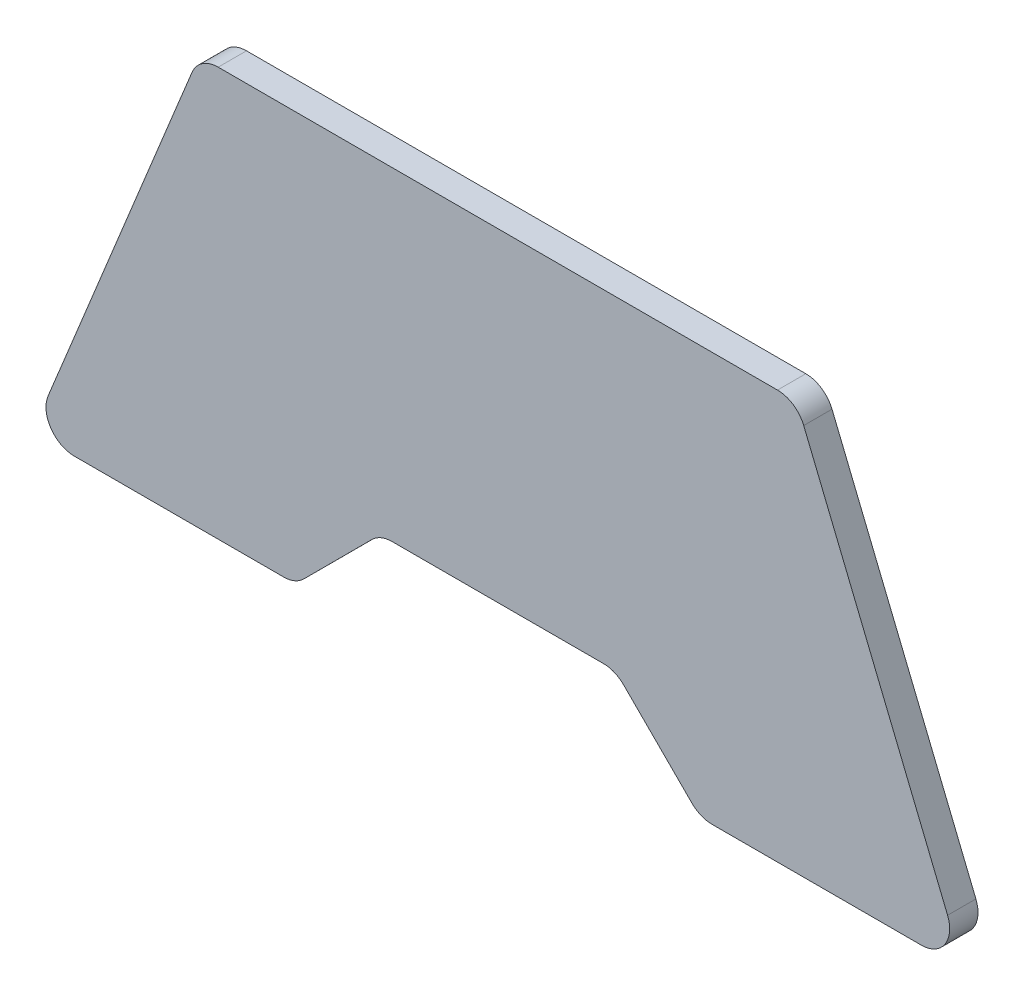
ISO-10303-21;
HEADER;
FILE_DESCRIPTION(('STEP AP214'),'2;1');
FILE_NAME('part.step','',(''),(''),'','','');
FILE_SCHEMA(('AUTOMOTIVE_DESIGN { 1 0 10303 214 1 1 1 1 }'));
ENDSEC;
DATA;
#1=APPLICATION_CONTEXT('core data for automotive mechanical design processes');
#2=APPLICATION_PROTOCOL_DEFINITION('international standard','automotive_design',2000,#1);
#3=PRODUCT_CONTEXT('',#1,'mechanical');
#4=PRODUCT('Part','Part','',(#3));
#5=PRODUCT_RELATED_PRODUCT_CATEGORY('part','',(#4));
#6=PRODUCT_DEFINITION_FORMATION('','',#4);
#7=PRODUCT_DEFINITION_CONTEXT('part definition',#1,'design');
#8=PRODUCT_DEFINITION('design','',#6,#7);
#9=PRODUCT_DEFINITION_SHAPE('','',#8);
#10=(LENGTH_UNIT() NAMED_UNIT(*) SI_UNIT(.MILLI.,.METRE.));
#11=(NAMED_UNIT(*) PLANE_ANGLE_UNIT() SI_UNIT($,.RADIAN.));
#12=(NAMED_UNIT(*) SI_UNIT($,.STERADIAN.) SOLID_ANGLE_UNIT());
#13=UNCERTAINTY_MEASURE_WITH_UNIT(LENGTH_MEASURE(1.E-05),#10,'distance_accuracy_value','');
#14=(GEOMETRIC_REPRESENTATION_CONTEXT(3) GLOBAL_UNCERTAINTY_ASSIGNED_CONTEXT((#13)) GLOBAL_UNIT_ASSIGNED_CONTEXT((#10,
#11,#12)) REPRESENTATION_CONTEXT('',''));
#15=CARTESIAN_POINT('',(0.,0.,0.));
#16=DIRECTION('',(0.,0.,1.));
#17=DIRECTION('',(1.,0.,0.));
#18=AXIS2_PLACEMENT_3D('',#15,#16,#17);
#19=CARTESIAN_POINT('',(-37.8060391873772,-9.99999999999998,5.));
#20=DIRECTION('',(0.,0.,-1.));
#21=DIRECTION('',(-1.,0.,0.));
#22=AXIS2_PLACEMENT_3D('',#19,#20,#21);
#23=CYLINDRICAL_SURFACE('',#22,5.);
#24=CARTESIAN_POINT('',(-37.8060391873772,-9.99999999999998,0.));
#25=DIRECTION('',(0.,0.,1.));
#26=DIRECTION('',(-1.,0.,0.));
#27=AXIS2_PLACEMENT_3D('',#24,#25,#26);
#28=CIRCLE('',#27,5.);
#29=CARTESIAN_POINT('',(-37.8060391873772,-15.,0.));
#30=VERTEX_POINT('',#29);
#31=CARTESIAN_POINT('',(-34.2683033383206,-13.5333305905759,0.));
#32=VERTEX_POINT('',#31);
#33=EDGE_CURVE('E177',#30,#32,#28,.T.);
#34=ORIENTED_EDGE('',*,*,#33,.T.);
#35=DIRECTION('',(0.,0.,-1.));
#36=VECTOR('',#35,1.);
#37=CARTESIAN_POINT('',(-34.2683033383206,-13.5333305905759,5.));
#38=LINE('',#37,#36);
#39=CARTESIAN_POINT('',(-34.2683033383206,-13.5333305905759,5.));
#40=VERTEX_POINT('',#39);
#41=EDGE_CURVE('E11',#40,#32,#38,.T.);
#42=ORIENTED_EDGE('',*,*,#41,.F.);
#43=CARTESIAN_POINT('',(-37.8060391873772,-9.99999999999998,5.));
#44=DIRECTION('',(0.,0.,1.));
#45=DIRECTION('',(-1.,0.,0.));
#46=AXIS2_PLACEMENT_3D('',#43,#44,#45);
#47=CIRCLE('',#46,5.);
#48=CARTESIAN_POINT('',(-37.8060391873772,-15.,5.));
#49=VERTEX_POINT('',#48);
#50=EDGE_CURVE('E207',#49,#40,#47,.T.);
#51=ORIENTED_EDGE('',*,*,#50,.F.);
#52=DIRECTION('',(0.,0.,-1.));
#53=VECTOR('',#52,1.);
#54=CARTESIAN_POINT('',(-37.8060391873772,-15.,5.));
#55=LINE('',#54,#53);
#56=EDGE_CURVE('E173',#49,#30,#55,.T.);
#57=ORIENTED_EDGE('',*,*,#56,.T.);
#58=EDGE_LOOP('',(#34,#42,#51,#57));
#59=FACE_BOUND('',#58,.T.);
#60=ADVANCED_FACE('F33',(#59),#23,.T.);
#61=CARTESIAN_POINT('',(-22.2166678017531,-1.46666940942405,5.));
#62=DIRECTION('',(-0.70754716981132,0.70666611811519,0.));
#63=DIRECTION('',(-0.70666611811519,-0.70754716981132,0.));
#64=AXIS2_PLACEMENT_3D('',#61,#62,#63);
#65=PLANE('',#64);
#66=DIRECTION('',(0.70666611811519,0.70754716981132,0.));
#67=VECTOR('',#66,1.);
#68=CARTESIAN_POINT('',(-22.2166678017531,-1.46666940942405,0.));
#69=LINE('',#68,#67);
#70=CARTESIAN_POINT('',(-22.2166678017531,-1.46666940942405,0.));
#71=VERTEX_POINT('',#70);
#72=EDGE_CURVE('E180',#32,#71,#69,.T.);
#73=ORIENTED_EDGE('',*,*,#72,.T.);
#74=DIRECTION('',(0.,0.,-1.));
#75=VECTOR('',#74,1.);
#76=CARTESIAN_POINT('',(-22.2166678017531,-1.46666940942405,5.));
#77=LINE('',#76,#75);
#78=CARTESIAN_POINT('',(-22.2166678017531,-1.46666940942405,5.));
#79=VERTEX_POINT('',#78);
#80=EDGE_CURVE('E41',#79,#71,#77,.T.);
#81=ORIENTED_EDGE('',*,*,#80,.F.);
#82=DIRECTION('',(0.70666611811519,0.70754716981132,0.));
#83=VECTOR('',#82,1.);
#84=CARTESIAN_POINT('',(-22.2166678017531,-1.46666940942405,5.));
#85=LINE('',#84,#83);
#86=EDGE_CURVE('E116',#40,#79,#85,.T.);
#87=ORIENTED_EDGE('',*,*,#86,.F.);
#88=ORIENTED_EDGE('',*,*,#41,.T.);
#89=EDGE_LOOP('',(#73,#81,#87,#88));
#90=FACE_BOUND('',#89,.T.);
#91=ADVANCED_FACE('F305',(#90),#65,.F.);
#92=CARTESIAN_POINT('',(-18.6789319526965,-5.,5.));
#93=DIRECTION('',(0.,0.,-1.));
#94=DIRECTION('',(-1.,0.,0.));
#95=AXIS2_PLACEMENT_3D('',#92,#93,#94);
#96=CYLINDRICAL_SURFACE('',#95,5.);
#97=CARTESIAN_POINT('',(-18.6789319526965,-5.,0.));
#98=DIRECTION('',(0.,0.,-1.));
#99=DIRECTION('',(1.,0.,0.));
#100=AXIS2_PLACEMENT_3D('',#97,#98,#99);
#101=CIRCLE('',#100,5.);
#102=CARTESIAN_POINT('',(-18.6789319526965,0.,0.));
#103=VERTEX_POINT('',#102);
#104=EDGE_CURVE('E182',#71,#103,#101,.T.);
#105=ORIENTED_EDGE('',*,*,#104,.T.);
#106=DIRECTION('',(0.,0.,-1.));
#107=VECTOR('',#106,1.);
#108=CARTESIAN_POINT('',(-18.6789319526965,0.,5.));
#109=LINE('',#108,#107);
#110=CARTESIAN_POINT('',(-18.6789319526965,0.,5.));
#111=VERTEX_POINT('',#110);
#112=EDGE_CURVE('E238',#111,#103,#109,.T.);
#113=ORIENTED_EDGE('',*,*,#112,.F.);
#114=CARTESIAN_POINT('',(-18.6789319526965,-5.,5.));
#115=DIRECTION('',(0.,0.,-1.));
#116=DIRECTION('',(1.,0.,0.));
#117=AXIS2_PLACEMENT_3D('',#114,#115,#116);
#118=CIRCLE('',#117,5.);
#119=EDGE_CURVE('E246',#79,#111,#118,.T.);
#120=ORIENTED_EDGE('',*,*,#119,.F.);
#121=ORIENTED_EDGE('',*,*,#80,.T.);
#122=EDGE_LOOP('',(#105,#113,#120,#121));
#123=FACE_BOUND('',#122,.T.);
#124=ADVANCED_FACE('F244',(#123),#96,.F.);
#125=CARTESIAN_POINT('',(18.6789319526965,0.,5.));
#126=DIRECTION('',(0.,1.,0.));
#127=DIRECTION('',(-1.,0.,0.));
#128=AXIS2_PLACEMENT_3D('',#125,#126,#127);
#129=PLANE('',#128);
#130=DIRECTION('',(1.,0.,0.));
#131=VECTOR('',#130,1.);
#132=CARTESIAN_POINT('',(18.6789319526965,0.,0.));
#133=LINE('',#132,#131);
#134=CARTESIAN_POINT('',(18.6789319526965,0.,0.));
#135=VERTEX_POINT('',#134);
#136=EDGE_CURVE('E184',#103,#135,#133,.T.);
#137=ORIENTED_EDGE('',*,*,#136,.T.);
#138=DIRECTION('',(0.,0.,-1.));
#139=VECTOR('',#138,1.);
#140=CARTESIAN_POINT('',(18.6789319526965,0.,5.));
#141=LINE('',#140,#139);
#142=CARTESIAN_POINT('',(18.6789319526965,0.,5.));
#143=VERTEX_POINT('',#142);
#144=EDGE_CURVE('E235',#143,#135,#141,.T.);
#145=ORIENTED_EDGE('',*,*,#144,.F.);
#146=DIRECTION('',(1.,0.,0.));
#147=VECTOR('',#146,1.);
#148=CARTESIAN_POINT('',(18.6789319526965,0.,5.));
#149=LINE('',#148,#147);
#150=EDGE_CURVE('E264',#111,#143,#149,.T.);
#151=ORIENTED_EDGE('',*,*,#150,.F.);
#152=ORIENTED_EDGE('',*,*,#112,.T.);
#153=EDGE_LOOP('',(#137,#145,#151,#152));
#154=FACE_BOUND('',#153,.T.);
#155=ADVANCED_FACE('F255',(#154),#129,.F.);
#156=CARTESIAN_POINT('',(18.6789319526965,-4.99999999999999,5.));
#157=DIRECTION('',(0.,0.,-1.));
#158=DIRECTION('',(-1.,0.,0.));
#159=AXIS2_PLACEMENT_3D('',#156,#157,#158);
#160=CYLINDRICAL_SURFACE('',#159,5.);
#161=CARTESIAN_POINT('',(18.6789319526965,-4.99999999999999,0.));
#162=DIRECTION('',(0.,0.,-1.));
#163=DIRECTION('',(1.,0.,0.));
#164=AXIS2_PLACEMENT_3D('',#161,#162,#163);
#165=CIRCLE('',#164,5.);
#166=CARTESIAN_POINT('',(22.2122625432725,-1.4622641509434,0.));
#167=VERTEX_POINT('',#166);
#168=EDGE_CURVE('E186',#135,#167,#165,.T.);
#169=ORIENTED_EDGE('',*,*,#168,.T.);
#170=DIRECTION('',(0.,0.,-1.));
#171=VECTOR('',#170,1.);
#172=CARTESIAN_POINT('',(22.2122625432725,-1.4622641509434,5.));
#173=LINE('',#172,#171);
#174=CARTESIAN_POINT('',(22.2122625432725,-1.4622641509434,5.));
#175=VERTEX_POINT('',#174);
#176=EDGE_CURVE('E232',#175,#167,#173,.T.);
#177=ORIENTED_EDGE('',*,*,#176,.F.);
#178=CARTESIAN_POINT('',(18.6789319526965,-4.99999999999999,5.));
#179=DIRECTION('',(0.,0.,-1.));
#180=DIRECTION('',(1.,0.,0.));
#181=AXIS2_PLACEMENT_3D('',#178,#179,#180);
#182=CIRCLE('',#181,5.);
#183=EDGE_CURVE('E261',#143,#175,#182,.T.);
#184=ORIENTED_EDGE('',*,*,#183,.F.);
#185=ORIENTED_EDGE('',*,*,#144,.T.);
#186=EDGE_LOOP('',(#169,#177,#184,#185));
#187=FACE_BOUND('',#186,.T.);
#188=ADVANCED_FACE('F259',(#187),#160,.F.);
#189=CARTESIAN_POINT('',(22.2122625432725,-1.46226415094339,5.));
#190=DIRECTION('',(0.706666118115189,0.70754716981132,0.));
#191=DIRECTION('',(-0.70754716981132,0.706666118115189,0.));
#192=AXIS2_PLACEMENT_3D('',#189,#190,#191);
#193=PLANE('',#192);
#194=DIRECTION('',(0.70754716981132,-0.70666611811519,0.));
#195=VECTOR('',#194,1.);
#196=CARTESIAN_POINT('',(22.2122625432725,-1.46226415094339,0.));
#197=LINE('',#196,#195);
#198=CARTESIAN_POINT('',(34.3027896042345,-13.5377358490566,0.));
#199=VERTEX_POINT('',#198);
#200=EDGE_CURVE('E188',#167,#199,#197,.T.);
#201=ORIENTED_EDGE('',*,*,#200,.T.);
#202=DIRECTION('',(0.,0.,-1.));
#203=VECTOR('',#202,1.);
#204=CARTESIAN_POINT('',(34.3027896042345,-13.5377358490566,5.));
#205=LINE('',#204,#203);
#206=CARTESIAN_POINT('',(34.3027896042345,-13.5377358490566,5.));
#207=VERTEX_POINT('',#206);
#208=EDGE_CURVE('E229',#207,#199,#205,.T.);
#209=ORIENTED_EDGE('',*,*,#208,.F.);
#210=DIRECTION('',(0.70754716981132,-0.70666611811519,0.));
#211=VECTOR('',#210,1.);
#212=CARTESIAN_POINT('',(22.2122625432725,-1.46226415094339,5.));
#213=LINE('',#212,#211);
#214=EDGE_CURVE('E263',#175,#207,#213,.T.);
#215=ORIENTED_EDGE('',*,*,#214,.F.);
#216=ORIENTED_EDGE('',*,*,#176,.T.);
#217=EDGE_LOOP('',(#201,#209,#215,#216));
#218=FACE_BOUND('',#217,.T.);
#219=ADVANCED_FACE('F318',(#218),#193,.F.);
#220=CARTESIAN_POINT('',(37.8361201948105,-10.,5.));
#221=DIRECTION('',(0.,0.,-1.));
#222=DIRECTION('',(-1.,0.,0.));
#223=AXIS2_PLACEMENT_3D('',#220,#221,#222);
#224=CYLINDRICAL_SURFACE('',#223,5.);
#225=CARTESIAN_POINT('',(37.8361201948105,-10.,0.));
#226=DIRECTION('',(0.,0.,1.));
#227=DIRECTION('',(-1.,0.,0.));
#228=AXIS2_PLACEMENT_3D('',#225,#226,#227);
#229=CIRCLE('',#228,5.);
#230=CARTESIAN_POINT('',(37.8361201948105,-15.,0.));
#231=VERTEX_POINT('',#230);
#232=EDGE_CURVE('E190',#199,#231,#229,.T.);
#233=ORIENTED_EDGE('',*,*,#232,.T.);
#234=DIRECTION('',(0.,0.,-1.));
#235=VECTOR('',#234,1.);
#236=CARTESIAN_POINT('',(37.8361201948105,-15.,5.));
#237=LINE('',#236,#235);
#238=CARTESIAN_POINT('',(37.8361201948105,-15.,5.));
#239=VERTEX_POINT('',#238);
#240=EDGE_CURVE('E226',#239,#231,#237,.T.);
#241=ORIENTED_EDGE('',*,*,#240,.F.);
#242=CARTESIAN_POINT('',(37.8361201948105,-10.,5.));
#243=DIRECTION('',(0.,0.,1.));
#244=DIRECTION('',(-1.,0.,0.));
#245=AXIS2_PLACEMENT_3D('',#242,#243,#244);
#246=CIRCLE('',#245,5.);
#247=EDGE_CURVE('E266',#207,#239,#246,.T.);
#248=ORIENTED_EDGE('',*,*,#247,.F.);
#249=ORIENTED_EDGE('',*,*,#208,.T.);
#250=EDGE_LOOP('',(#233,#241,#248,#249));
#251=FACE_BOUND('',#250,.T.);
#252=ADVANCED_FACE('F321',(#251),#224,.T.);
#253=CARTESIAN_POINT('',(37.8361201948105,-15.,5.));
#254=DIRECTION('',(0.,1.,0.));
#255=DIRECTION('',(-1.,0.,0.));
#256=AXIS2_PLACEMENT_3D('',#253,#254,#255);
#257=PLANE('',#256);
#258=DIRECTION('',(1.,0.,0.));
#259=VECTOR('',#258,1.);
#260=CARTESIAN_POINT('',(37.8361201948105,-15.,0.));
#261=LINE('',#260,#259);
#262=CARTESIAN_POINT('',(74.8229269436549,-15.,0.));
#263=VERTEX_POINT('',#262);
#264=EDGE_CURVE('E192',#231,#263,#261,.T.);
#265=ORIENTED_EDGE('',*,*,#264,.T.);
#266=DIRECTION('',(0.,0.,-1.));
#267=VECTOR('',#266,1.);
#268=CARTESIAN_POINT('',(74.8229269436549,-15.,5.));
#269=LINE('',#268,#267);
#270=CARTESIAN_POINT('',(74.8229269436549,-15.,5.));
#271=VERTEX_POINT('',#270);
#272=EDGE_CURVE('E223',#271,#263,#269,.T.);
#273=ORIENTED_EDGE('',*,*,#272,.F.);
#274=DIRECTION('',(1.,0.,0.));
#275=VECTOR('',#274,1.);
#276=CARTESIAN_POINT('',(37.8361201948105,-15.,5.));
#277=LINE('',#276,#275);
#278=EDGE_CURVE('E272',#239,#271,#277,.T.);
#279=ORIENTED_EDGE('',*,*,#278,.F.);
#280=ORIENTED_EDGE('',*,*,#240,.T.);
#281=EDGE_LOOP('',(#265,#273,#279,#280));
#282=FACE_BOUND('',#281,.T.);
#283=ADVANCED_FACE('F325',(#282),#257,.F.);
#284=CARTESIAN_POINT('',(74.8229269436549,-10.,5.));
#285=DIRECTION('',(0.,0.,-1.));
#286=DIRECTION('',(-1.,0.,0.));
#287=AXIS2_PLACEMENT_3D('',#284,#285,#286);
#288=CYLINDRICAL_SURFACE('',#287,5.);
#289=CARTESIAN_POINT('',(74.8229269436549,-10.,0.));
#290=DIRECTION('',(0.,0.,1.));
#291=DIRECTION('',(-1.,0.,0.));
#292=AXIS2_PLACEMENT_3D('',#289,#290,#291);
#293=CIRCLE('',#292,5.);
#294=CARTESIAN_POINT('',(79.4515357197421,-8.1089736125775,0.));
#295=VERTEX_POINT('',#294);
#296=EDGE_CURVE('E194',#263,#295,#293,.T.);
#297=ORIENTED_EDGE('',*,*,#296,.T.);
#298=DIRECTION('',(0.,0.,-1.));
#299=VECTOR('',#298,1.);
#300=CARTESIAN_POINT('',(79.4515357197421,-8.1089736125775,5.));
#301=LINE('',#300,#299);
#302=CARTESIAN_POINT('',(79.4515357197421,-8.1089736125775,5.));
#303=VERTEX_POINT('',#302);
#304=EDGE_CURVE('E220',#303,#295,#301,.T.);
#305=ORIENTED_EDGE('',*,*,#304,.F.);
#306=CARTESIAN_POINT('',(74.8229269436549,-10.,5.));
#307=DIRECTION('',(0.,0.,1.));
#308=DIRECTION('',(-1.,0.,0.));
#309=AXIS2_PLACEMENT_3D('',#306,#307,#308);
#310=CIRCLE('',#309,5.);
#311=EDGE_CURVE('E274',#271,#303,#310,.T.);
#312=ORIENTED_EDGE('',*,*,#311,.F.);
#313=ORIENTED_EDGE('',*,*,#272,.T.);
#314=EDGE_LOOP('',(#297,#305,#312,#313));
#315=FACE_BOUND('',#314,.T.);
#316=ADVANCED_FACE('F329',(#315),#288,.T.);
#317=CARTESIAN_POINT('',(54.0370419473089,54.0973232943836,5.));
#318=DIRECTION('',(-0.925721755217451,-0.378205277484492,0.));
#319=DIRECTION('',(0.378205277484492,-0.925721755217451,0.));
#320=AXIS2_PLACEMENT_3D('',#317,#318,#319);
#321=PLANE('',#320);
#322=DIRECTION('',(-0.378205277484492,0.925721755217451,0.));
#323=VECTOR('',#322,1.);
#324=CARTESIAN_POINT('',(54.0370419473089,54.0973232943836,0.));
#325=LINE('',#324,#323);
#326=CARTESIAN_POINT('',(54.0370419473089,54.0973232943836,0.));
#327=VERTEX_POINT('',#326);
#328=EDGE_CURVE('E196',#295,#327,#325,.T.);
#329=ORIENTED_EDGE('',*,*,#328,.T.);
#330=DIRECTION('',(0.,0.,-1.));
#331=VECTOR('',#330,1.);
#332=CARTESIAN_POINT('',(54.0370419473089,54.0973232943836,5.));
#333=LINE('',#332,#331);
#334=CARTESIAN_POINT('',(54.0370419473089,54.0973232943836,5.));
#335=VERTEX_POINT('',#334);
#336=EDGE_CURVE('E217',#335,#327,#333,.T.);
#337=ORIENTED_EDGE('',*,*,#336,.F.);
#338=DIRECTION('',(-0.378205277484492,0.925721755217451,0.));
#339=VECTOR('',#338,1.);
#340=CARTESIAN_POINT('',(54.0370419473089,54.0973232943836,5.));
#341=LINE('',#340,#339);
#342=EDGE_CURVE('E276',#303,#335,#341,.T.);
#343=ORIENTED_EDGE('',*,*,#342,.F.);
#344=ORIENTED_EDGE('',*,*,#304,.T.);
#345=EDGE_LOOP('',(#329,#337,#343,#344));
#346=FACE_BOUND('',#345,.T.);
#347=ADVANCED_FACE('F333',(#346),#321,.F.);
#348=CARTESIAN_POINT('',(49.4084331712216,52.2062969069612,5.));
#349=DIRECTION('',(0.,0.,-1.));
#350=DIRECTION('',(-1.,0.,0.));
#351=AXIS2_PLACEMENT_3D('',#348,#349,#350);
#352=CYLINDRICAL_SURFACE('',#351,5.);
#353=CARTESIAN_POINT('',(49.4084331712216,52.2062969069612,0.));
#354=DIRECTION('',(0.,0.,1.));
#355=DIRECTION('',(1.,0.,0.));
#356=AXIS2_PLACEMENT_3D('',#353,#354,#355);
#357=CIRCLE('',#356,5.);
#358=CARTESIAN_POINT('',(49.4084331712216,57.2062969069612,0.));
#359=VERTEX_POINT('',#358);
#360=EDGE_CURVE('E198',#327,#359,#357,.T.);
#361=ORIENTED_EDGE('',*,*,#360,.T.);
#362=DIRECTION('',(0.,0.,-1.));
#363=VECTOR('',#362,1.);
#364=CARTESIAN_POINT('',(49.4084331712216,57.2062969069612,5.));
#365=LINE('',#364,#363);
#366=CARTESIAN_POINT('',(49.4084331712216,57.2062969069612,5.));
#367=VERTEX_POINT('',#366);
#368=EDGE_CURVE('E214',#367,#359,#365,.T.);
#369=ORIENTED_EDGE('',*,*,#368,.F.);
#370=CARTESIAN_POINT('',(49.4084331712216,52.2062969069612,5.));
#371=DIRECTION('',(0.,0.,1.));
#372=DIRECTION('',(1.,0.,0.));
#373=AXIS2_PLACEMENT_3D('',#370,#371,#372);
#374=CIRCLE('',#373,5.);
#375=EDGE_CURVE('E278',#335,#367,#374,.T.);
#376=ORIENTED_EDGE('',*,*,#375,.F.);
#377=ORIENTED_EDGE('',*,*,#336,.T.);
#378=EDGE_LOOP('',(#361,#369,#376,#377));
#379=FACE_BOUND('',#378,.T.);
#380=ADVANCED_FACE('F337',(#379),#352,.T.);
#381=CARTESIAN_POINT('',(-49.3747027277565,57.2062969069612,5.));
#382=DIRECTION('',(0.,-1.,0.));
#383=DIRECTION('',(1.,0.,0.));
#384=AXIS2_PLACEMENT_3D('',#381,#382,#383);
#385=PLANE('',#384);
#386=DIRECTION('',(-1.,0.,0.));
#387=VECTOR('',#386,1.);
#388=CARTESIAN_POINT('',(-49.3747027277565,57.2062969069612,0.));
#389=LINE('',#388,#387);
#390=CARTESIAN_POINT('',(-49.3747027277565,57.2062969069612,0.));
#391=VERTEX_POINT('',#390);
#392=EDGE_CURVE('E200',#359,#391,#389,.T.);
#393=ORIENTED_EDGE('',*,*,#392,.T.);
#394=DIRECTION('',(0.,0.,-1.));
#395=VECTOR('',#394,1.);
#396=CARTESIAN_POINT('',(-49.3747027277565,57.2062969069612,5.));
#397=LINE('',#396,#395);
#398=CARTESIAN_POINT('',(-49.3747027277565,57.2062969069612,5.));
#399=VERTEX_POINT('',#398);
#400=EDGE_CURVE('E211',#399,#391,#397,.T.);
#401=ORIENTED_EDGE('',*,*,#400,.F.);
#402=DIRECTION('',(-1.,0.,0.));
#403=VECTOR('',#402,1.);
#404=CARTESIAN_POINT('',(-49.3747027277565,57.2062969069612,5.));
#405=LINE('',#404,#403);
#406=EDGE_CURVE('E280',#367,#399,#405,.T.);
#407=ORIENTED_EDGE('',*,*,#406,.F.);
#408=ORIENTED_EDGE('',*,*,#368,.T.);
#409=EDGE_LOOP('',(#393,#401,#407,#408));
#410=FACE_BOUND('',#409,.T.);
#411=ADVANCED_FACE('F286',(#410),#385,.F.);
#412=CARTESIAN_POINT('',(-49.3747027277565,52.2062969069612,5.));
#413=DIRECTION('',(0.,0.,-1.));
#414=DIRECTION('',(-1.,0.,0.));
#415=AXIS2_PLACEMENT_3D('',#412,#413,#414);
#416=CYLINDRICAL_SURFACE('',#415,5.);
#417=CARTESIAN_POINT('',(-49.3747027277565,52.2062969069612,0.));
#418=DIRECTION('',(0.,0.,1.));
#419=DIRECTION('',(1.,0.,0.));
#420=AXIS2_PLACEMENT_3D('',#417,#418,#419);
#421=CIRCLE('',#420,5.);
#422=CARTESIAN_POINT('',(-54.0033115038438,54.0973232943836,0.));
#423=VERTEX_POINT('',#422);
#424=EDGE_CURVE('E202',#391,#423,#421,.T.);
#425=ORIENTED_EDGE('',*,*,#424,.T.);
#426=DIRECTION('',(0.,0.,-1.));
#427=VECTOR('',#426,1.);
#428=CARTESIAN_POINT('',(-54.0033115038438,54.0973232943836,5.));
#429=LINE('',#428,#427);
#430=CARTESIAN_POINT('',(-54.0033115038438,54.0973232943836,5.));
#431=VERTEX_POINT('',#430);
#432=EDGE_CURVE('E168',#431,#423,#429,.T.);
#433=ORIENTED_EDGE('',*,*,#432,.F.);
#434=CARTESIAN_POINT('',(-49.3747027277565,52.2062969069612,5.));
#435=DIRECTION('',(0.,0.,1.));
#436=DIRECTION('',(1.,0.,0.));
#437=AXIS2_PLACEMENT_3D('',#434,#435,#436);
#438=CIRCLE('',#437,5.);
#439=EDGE_CURVE('E159',#399,#431,#438,.T.);
#440=ORIENTED_EDGE('',*,*,#439,.F.);
#441=ORIENTED_EDGE('',*,*,#400,.T.);
#442=EDGE_LOOP('',(#425,#433,#440,#441));
#443=FACE_BOUND('',#442,.T.);
#444=ADVANCED_FACE('F290',(#443),#416,.T.);
#445=CARTESIAN_POINT('',(-79.4178052762771,-8.10897361257745,5.));
#446=DIRECTION('',(0.925721755217451,-0.378205277484493,0.));
#447=DIRECTION('',(0.378205277484493,0.925721755217451,0.));
#448=AXIS2_PLACEMENT_3D('',#445,#446,#447);
#449=PLANE('',#448);
#450=DIRECTION('',(-0.378205277484493,-0.925721755217451,0.));
#451=VECTOR('',#450,1.);
#452=CARTESIAN_POINT('',(-79.4178052762771,-8.10897361257745,0.));
#453=LINE('',#452,#451);
#454=CARTESIAN_POINT('',(-79.4178052762771,-8.10897361257745,0.));
#455=VERTEX_POINT('',#454);
#456=EDGE_CURVE('E167',#423,#455,#453,.T.);
#457=ORIENTED_EDGE('',*,*,#456,.T.);
#458=DIRECTION('',(0.,0.,-1.));
#459=VECTOR('',#458,1.);
#460=CARTESIAN_POINT('',(-79.4178052762771,-8.10897361257745,5.));
#461=LINE('',#460,#459);
#462=CARTESIAN_POINT('',(-79.4178052762771,-8.10897361257745,5.));
#463=VERTEX_POINT('',#462);
#464=EDGE_CURVE('E164',#463,#455,#461,.T.);
#465=ORIENTED_EDGE('',*,*,#464,.F.);
#466=DIRECTION('',(-0.378205277484493,-0.925721755217451,0.));
#467=VECTOR('',#466,1.);
#468=CARTESIAN_POINT('',(-79.4178052762771,-8.10897361257745,5.));
#469=LINE('',#468,#467);
#470=EDGE_CURVE('E153',#431,#463,#469,.T.);
#471=ORIENTED_EDGE('',*,*,#470,.F.);
#472=ORIENTED_EDGE('',*,*,#432,.T.);
#473=EDGE_LOOP('',(#457,#465,#471,#472));
#474=FACE_BOUND('',#473,.T.);
#475=ADVANCED_FACE('F165',(#474),#449,.F.);
#476=CARTESIAN_POINT('',(-74.7891965001899,-9.99999999999997,5.));
#477=DIRECTION('',(0.,0.,-1.));
#478=DIRECTION('',(-1.,0.,0.));
#479=AXIS2_PLACEMENT_3D('',#476,#477,#478);
#480=CYLINDRICAL_SURFACE('',#479,5.00000000000001);
#481=CARTESIAN_POINT('',(-74.7891965001899,-9.99999999999997,0.));
#482=DIRECTION('',(0.,0.,1.));
#483=DIRECTION('',(1.,0.,0.));
#484=AXIS2_PLACEMENT_3D('',#481,#482,#483);
#485=CIRCLE('',#484,5.00000000000001);
#486=CARTESIAN_POINT('',(-74.7891965001898,-15.,0.));
#487=VERTEX_POINT('',#486);
#488=EDGE_CURVE('E102',#455,#487,#485,.T.);
#489=ORIENTED_EDGE('',*,*,#488,.T.);
#490=DIRECTION('',(0.,0.,-1.));
#491=VECTOR('',#490,1.);
#492=CARTESIAN_POINT('',(-74.7891965001898,-15.,5.));
#493=LINE('',#492,#491);
#494=CARTESIAN_POINT('',(-74.7891965001898,-15.,5.));
#495=VERTEX_POINT('',#494);
#496=EDGE_CURVE('E169',#495,#487,#493,.T.);
#497=ORIENTED_EDGE('',*,*,#496,.F.);
#498=CARTESIAN_POINT('',(-74.7891965001899,-9.99999999999997,5.));
#499=DIRECTION('',(0.,0.,1.));
#500=DIRECTION('',(1.,0.,0.));
#501=AXIS2_PLACEMENT_3D('',#498,#499,#500);
#502=CIRCLE('',#501,5.00000000000001);
#503=EDGE_CURVE('E157',#463,#495,#502,.T.);
#504=ORIENTED_EDGE('',*,*,#503,.F.);
#505=ORIENTED_EDGE('',*,*,#464,.T.);
#506=EDGE_LOOP('',(#489,#497,#504,#505));
#507=FACE_BOUND('',#506,.T.);
#508=ADVANCED_FACE('F171',(#507),#480,.T.);
#509=CARTESIAN_POINT('',(-37.8060391873772,-15.,5.));
#510=DIRECTION('',(0.,1.,0.));
#511=DIRECTION('',(-1.,0.,0.));
#512=AXIS2_PLACEMENT_3D('',#509,#510,#511);
#513=PLANE('',#512);
#514=DIRECTION('',(1.,0.,0.));
#515=VECTOR('',#514,1.);
#516=CARTESIAN_POINT('',(-37.8060391873772,-15.,0.));
#517=LINE('',#516,#515);
#518=EDGE_CURVE('E108',#487,#30,#517,.T.);
#519=ORIENTED_EDGE('',*,*,#518,.T.);
#520=ORIENTED_EDGE('',*,*,#56,.F.);
#521=DIRECTION('',(1.,0.,0.));
#522=VECTOR('',#521,1.);
#523=CARTESIAN_POINT('',(-37.8060391873772,-15.,5.));
#524=LINE('',#523,#522);
#525=EDGE_CURVE('E49',#495,#49,#524,.T.);
#526=ORIENTED_EDGE('',*,*,#525,.F.);
#527=ORIENTED_EDGE('',*,*,#496,.T.);
#528=EDGE_LOOP('',(#519,#520,#526,#527));
#529=FACE_BOUND('',#528,.T.);
#530=ADVANCED_FACE('F294',(#529),#513,.F.);
#531=CARTESIAN_POINT('',(-37.8060391873772,-9.99999999999998,5.));
#532=DIRECTION('',(0.,0.,-1.));
#533=DIRECTION('',(-1.,0.,0.));
#534=AXIS2_PLACEMENT_3D('',#531,#532,#533);
#535=PLANE('',#534);
#536=ORIENTED_EDGE('',*,*,#50,.T.);
#537=ORIENTED_EDGE('',*,*,#86,.T.);
#538=ORIENTED_EDGE('',*,*,#119,.T.);
#539=ORIENTED_EDGE('',*,*,#150,.T.);
#540=ORIENTED_EDGE('',*,*,#183,.T.);
#541=ORIENTED_EDGE('',*,*,#214,.T.);
#542=ORIENTED_EDGE('',*,*,#247,.T.);
#543=ORIENTED_EDGE('',*,*,#278,.T.);
#544=ORIENTED_EDGE('',*,*,#311,.T.);
#545=ORIENTED_EDGE('',*,*,#342,.T.);
#546=ORIENTED_EDGE('',*,*,#375,.T.);
#547=ORIENTED_EDGE('',*,*,#406,.T.);
#548=ORIENTED_EDGE('',*,*,#439,.T.);
#549=ORIENTED_EDGE('',*,*,#470,.T.);
#550=ORIENTED_EDGE('',*,*,#503,.T.);
#551=ORIENTED_EDGE('',*,*,#525,.T.);
#552=EDGE_LOOP('',(#536,#537,#538,#539,#540,#541,#542,#543,#544,#545,#546,#547,#548,#549,#550,#551));
#553=FACE_BOUND('',#552,.T.);
#554=ADVANCED_FACE('F155',(#553),#535,.F.);
#555=CARTESIAN_POINT('',(-37.8060391873772,-9.99999999999998,0.));
#556=DIRECTION('',(0.,0.,-1.));
#557=DIRECTION('',(-1.,0.,0.));
#558=AXIS2_PLACEMENT_3D('',#555,#556,#557);
#559=PLANE('',#558);
#560=ORIENTED_EDGE('',*,*,#33,.F.);
#561=ORIENTED_EDGE('',*,*,#518,.F.);
#562=ORIENTED_EDGE('',*,*,#488,.F.);
#563=ORIENTED_EDGE('',*,*,#456,.F.);
#564=ORIENTED_EDGE('',*,*,#424,.F.);
#565=ORIENTED_EDGE('',*,*,#392,.F.);
#566=ORIENTED_EDGE('',*,*,#360,.F.);
#567=ORIENTED_EDGE('',*,*,#328,.F.);
#568=ORIENTED_EDGE('',*,*,#296,.F.);
#569=ORIENTED_EDGE('',*,*,#264,.F.);
#570=ORIENTED_EDGE('',*,*,#232,.F.);
#571=ORIENTED_EDGE('',*,*,#200,.F.);
#572=ORIENTED_EDGE('',*,*,#168,.F.);
#573=ORIENTED_EDGE('',*,*,#136,.F.);
#574=ORIENTED_EDGE('',*,*,#104,.F.);
#575=ORIENTED_EDGE('',*,*,#72,.F.);
#576=EDGE_LOOP('',(#560,#561,#562,#563,#564,#565,#566,#567,#568,#569,#570,#571,#572,#573,#574,#575));
#577=FACE_BOUND('',#576,.T.);
#578=ADVANCED_FACE('F250',(#577),#559,.T.);
#579=CLOSED_SHELL('',(#60,#91,#124,#155,#188,#219,#252,#283,#316,#347,#380,#411,#444,#475,#508,
#530,#554,#578));
#580=MANIFOLD_SOLID_BREP('B2',#579);
#581=ADVANCED_BREP_SHAPE_REPRESENTATION('',(#18,#580),#14);
#582=SHAPE_DEFINITION_REPRESENTATION(#9,#581);
ENDSEC;
END-ISO-10303-21;
